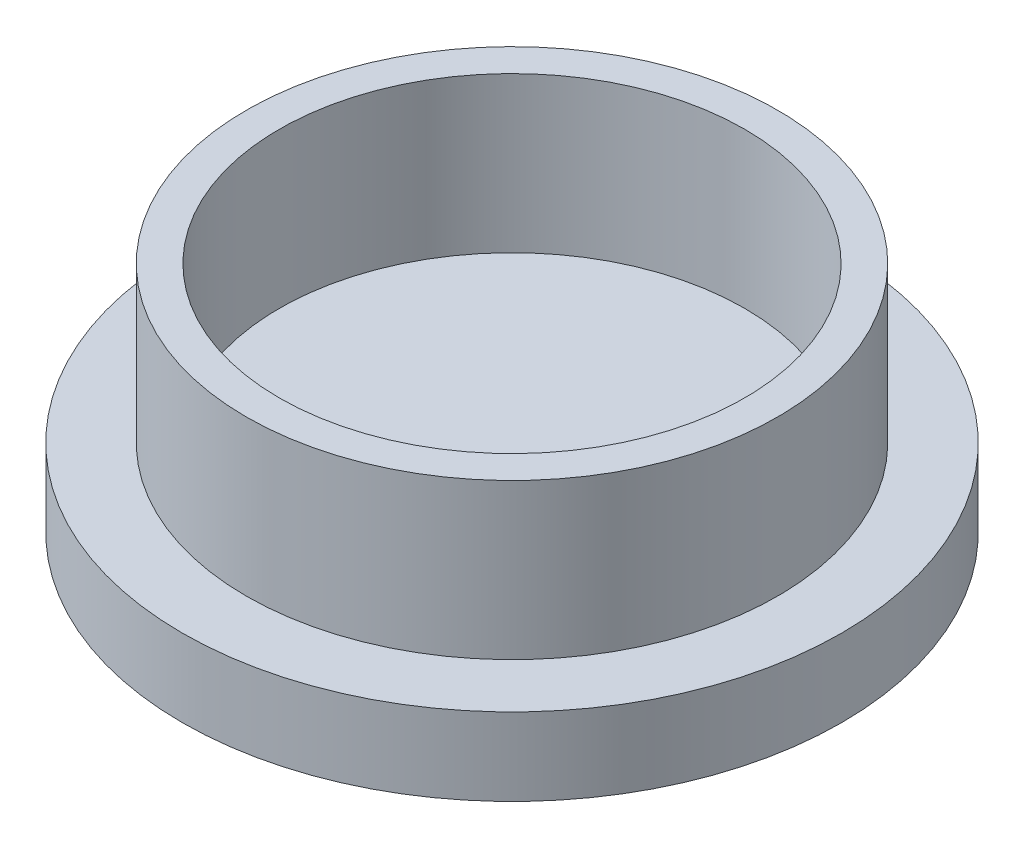
ISO-10303-21;
HEADER;
FILE_DESCRIPTION(('STEP AP214'),'2;1');
FILE_NAME('part.step','',(''),(''),'','','');
FILE_SCHEMA(('AUTOMOTIVE_DESIGN { 1 0 10303 214 1 1 1 1 }'));
ENDSEC;
DATA;
#1=APPLICATION_CONTEXT('core data for automotive mechanical design processes');
#2=APPLICATION_PROTOCOL_DEFINITION('international standard','automotive_design',2000,#1);
#3=PRODUCT_CONTEXT('',#1,'mechanical');
#4=PRODUCT('Part','Part','',(#3));
#5=PRODUCT_RELATED_PRODUCT_CATEGORY('part','',(#4));
#6=PRODUCT_DEFINITION_FORMATION('','',#4);
#7=PRODUCT_DEFINITION_CONTEXT('part definition',#1,'design');
#8=PRODUCT_DEFINITION('design','',#6,#7);
#9=PRODUCT_DEFINITION_SHAPE('','',#8);
#10=(LENGTH_UNIT() NAMED_UNIT(*) SI_UNIT(.MILLI.,.METRE.));
#11=(NAMED_UNIT(*) PLANE_ANGLE_UNIT() SI_UNIT($,.RADIAN.));
#12=(NAMED_UNIT(*) SI_UNIT($,.STERADIAN.) SOLID_ANGLE_UNIT());
#13=UNCERTAINTY_MEASURE_WITH_UNIT(LENGTH_MEASURE(1.E-05),#10,'distance_accuracy_value','');
#14=(GEOMETRIC_REPRESENTATION_CONTEXT(3) GLOBAL_UNCERTAINTY_ASSIGNED_CONTEXT((#13)) GLOBAL_UNIT_ASSIGNED_CONTEXT((#10,
#11,#12)) REPRESENTATION_CONTEXT('',''));
#15=CARTESIAN_POINT('',(0.,0.,0.));
#16=DIRECTION('',(0.,0.,1.));
#17=DIRECTION('',(1.,0.,0.));
#18=AXIS2_PLACEMENT_3D('',#15,#16,#17);
#19=CARTESIAN_POINT('',(0.,2.,0.));
#20=DIRECTION('',(0.,-1.,0.));
#21=DIRECTION('',(0.,0.,-1.));
#22=AXIS2_PLACEMENT_3D('',#19,#20,#21);
#23=CYLINDRICAL_SURFACE('',#22,3.425);
#24=CARTESIAN_POINT('',(0.,2.,0.));
#25=DIRECTION('',(0.,1.,0.));
#26=DIRECTION('',(0.,0.,1.));
#27=AXIS2_PLACEMENT_3D('',#24,#25,#26);
#28=CIRCLE('',#27,3.425);
#29=CARTESIAN_POINT('',(0.,2.,3.425));
#30=VERTEX_POINT('',#29);
#31=EDGE_CURVE('E10',#30,#30,#28,.T.);
#32=ORIENTED_EDGE('',*,*,#31,.F.);
#33=EDGE_LOOP('',(#32));
#34=FACE_BOUND('',#33,.T.);
#35=CARTESIAN_POINT('',(0.,0.,0.));
#36=DIRECTION('',(0.,1.,0.));
#37=DIRECTION('',(0.,0.,1.));
#38=AXIS2_PLACEMENT_3D('',#35,#36,#37);
#39=CIRCLE('',#38,3.425);
#40=CARTESIAN_POINT('',(0.,0.,3.425));
#41=VERTEX_POINT('',#40);
#42=EDGE_CURVE('E40',#41,#41,#39,.T.);
#43=ORIENTED_EDGE('',*,*,#42,.T.);
#44=EDGE_LOOP('',(#43));
#45=FACE_BOUND('',#44,.T.);
#46=ADVANCED_FACE('F37',(#34,#45),#23,.T.);
#47=CARTESIAN_POINT('',(0.,2.,0.));
#48=DIRECTION('',(0.,1.,0.));
#49=DIRECTION('',(0.,0.,1.));
#50=AXIS2_PLACEMENT_3D('',#47,#48,#49);
#51=PLANE('',#50);
#52=CARTESIAN_POINT('',(0.,2.,0.));
#53=DIRECTION('',(0.,1.,0.));
#54=DIRECTION('',(0.,0.,1.));
#55=AXIS2_PLACEMENT_3D('',#52,#53,#54);
#56=CIRCLE('',#55,3.);
#57=CARTESIAN_POINT('',(0.,2.,3.));
#58=VERTEX_POINT('',#57);
#59=EDGE_CURVE('E55',#58,#58,#56,.T.);
#60=ORIENTED_EDGE('',*,*,#59,.F.);
#61=EDGE_LOOP('',(#60));
#62=FACE_BOUND('',#61,.T.);
#63=ORIENTED_EDGE('',*,*,#31,.T.);
#64=EDGE_LOOP('',(#63));
#65=FACE_BOUND('',#64,.T.);
#66=ADVANCED_FACE('F70',(#62,#65),#51,.T.);
#67=CARTESIAN_POINT('',(0.,-1.,0.));
#68=DIRECTION('',(0.,1.,0.));
#69=DIRECTION('',(0.,0.,1.));
#70=AXIS2_PLACEMENT_3D('',#67,#68,#69);
#71=CYLINDRICAL_SURFACE('',#70,4.25);
#72=CARTESIAN_POINT('',(0.,-1.,0.));
#73=DIRECTION('',(0.,-1.,0.));
#74=DIRECTION('',(0.,0.,-1.));
#75=AXIS2_PLACEMENT_3D('',#72,#73,#74);
#76=CIRCLE('',#75,4.25);
#77=CARTESIAN_POINT('',(0.,-1.,-4.25));
#78=VERTEX_POINT('',#77);
#79=EDGE_CURVE('E47',#78,#78,#76,.T.);
#80=ORIENTED_EDGE('',*,*,#79,.F.);
#81=EDGE_LOOP('',(#80));
#82=FACE_BOUND('',#81,.T.);
#83=CARTESIAN_POINT('',(0.,0.,0.));
#84=DIRECTION('',(0.,-1.,0.));
#85=DIRECTION('',(0.,0.,-1.));
#86=AXIS2_PLACEMENT_3D('',#83,#84,#85);
#87=CIRCLE('',#86,4.25);
#88=CARTESIAN_POINT('',(0.,0.,-4.25));
#89=VERTEX_POINT('',#88);
#90=EDGE_CURVE('E49',#89,#89,#87,.T.);
#91=ORIENTED_EDGE('',*,*,#90,.T.);
#92=EDGE_LOOP('',(#91));
#93=FACE_BOUND('',#92,.T.);
#94=ADVANCED_FACE('F72',(#82,#93),#71,.T.);
#95=CARTESIAN_POINT('',(0.,-1.,0.));
#96=DIRECTION('',(0.,-1.,0.));
#97=DIRECTION('',(0.,0.,-1.));
#98=AXIS2_PLACEMENT_3D('',#95,#96,#97);
#99=PLANE('',#98);
#100=ORIENTED_EDGE('',*,*,#79,.T.);
#101=EDGE_LOOP('',(#100));
#102=FACE_BOUND('',#101,.T.);
#103=ADVANCED_FACE('F77',(#102),#99,.T.);
#104=CARTESIAN_POINT('',(0.,0.,0.));
#105=DIRECTION('',(0.,-1.,0.));
#106=DIRECTION('',(0.,0.,-1.));
#107=AXIS2_PLACEMENT_3D('',#104,#105,#106);
#108=PLANE('',#107);
#109=ORIENTED_EDGE('',*,*,#42,.F.);
#110=EDGE_LOOP('',(#109));
#111=FACE_BOUND('',#110,.T.);
#112=ORIENTED_EDGE('',*,*,#90,.F.);
#113=EDGE_LOOP('',(#112));
#114=FACE_BOUND('',#113,.T.);
#115=ADVANCED_FACE('F66',(#111,#114),#108,.F.);
#116=CARTESIAN_POINT('',(0.,0.,0.));
#117=DIRECTION('',(0.,1.,0.));
#118=DIRECTION('',(0.,0.,1.));
#119=AXIS2_PLACEMENT_3D('',#116,#117,#118);
#120=CYLINDRICAL_SURFACE('',#119,3.);
#121=CARTESIAN_POINT('',(0.,0.,0.));
#122=DIRECTION('',(0.,1.,0.));
#123=DIRECTION('',(0.,0.,1.));
#124=AXIS2_PLACEMENT_3D('',#121,#122,#123);
#125=CIRCLE('',#124,3.);
#126=CARTESIAN_POINT('',(0.,0.,3.));
#127=VERTEX_POINT('',#126);
#128=EDGE_CURVE('E52',#127,#127,#125,.T.);
#129=ORIENTED_EDGE('',*,*,#128,.F.);
#130=EDGE_LOOP('',(#129));
#131=FACE_BOUND('',#130,.T.);
#132=ORIENTED_EDGE('',*,*,#59,.T.);
#133=EDGE_LOOP('',(#132));
#134=FACE_BOUND('',#133,.T.);
#135=ADVANCED_FACE('F63',(#131,#134),#120,.F.);
#136=CARTESIAN_POINT('',(0.,0.,0.));
#137=DIRECTION('',(0.,1.,0.));
#138=DIRECTION('',(0.,0.,1.));
#139=AXIS2_PLACEMENT_3D('',#136,#137,#138);
#140=PLANE('',#139);
#141=ORIENTED_EDGE('',*,*,#128,.T.);
#142=EDGE_LOOP('',(#141));
#143=FACE_BOUND('',#142,.T.);
#144=ADVANCED_FACE('F61',(#143),#140,.T.);
#145=CLOSED_SHELL('',(#46,#66,#94,#103,#115,#135,#144));
#146=MANIFOLD_SOLID_BREP('B2',#145);
#147=ADVANCED_BREP_SHAPE_REPRESENTATION('',(#18,#146),#14);
#148=SHAPE_DEFINITION_REPRESENTATION(#9,#147);
ENDSEC;
END-ISO-10303-21;
